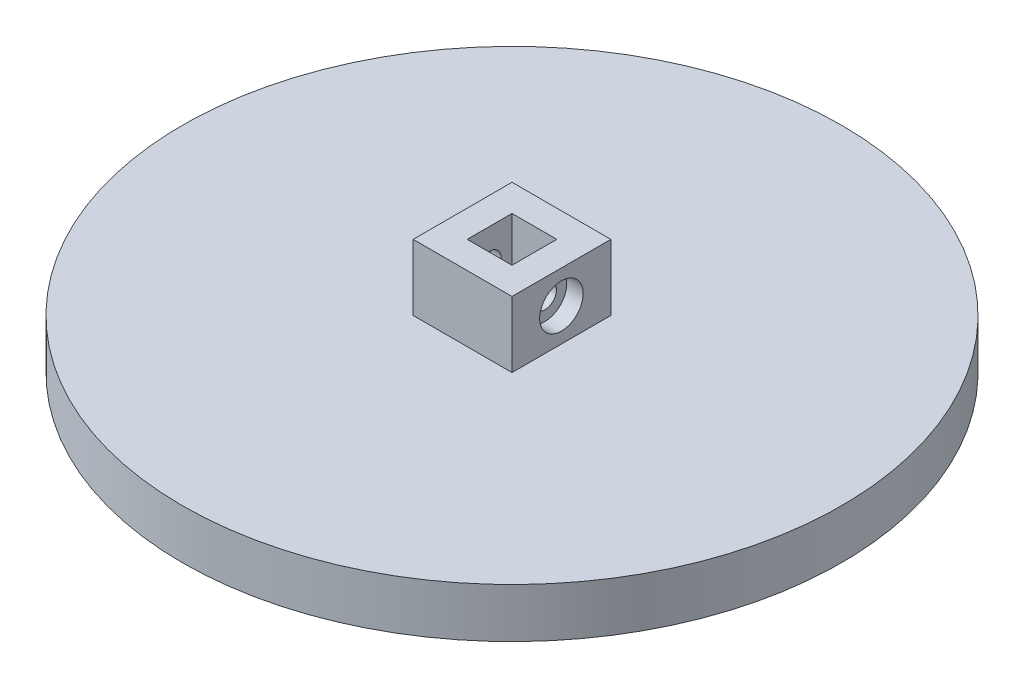
ISO-10303-21;
HEADER;
FILE_DESCRIPTION(('STEP AP214'),'2;1');
FILE_NAME('part.step','',(''),(''),'','','');
FILE_SCHEMA(('AUTOMOTIVE_DESIGN { 1 0 10303 214 1 1 1 1 }'));
ENDSEC;
DATA;
#1=APPLICATION_CONTEXT('core data for automotive mechanical design processes');
#2=APPLICATION_PROTOCOL_DEFINITION('international standard','automotive_design',2000,#1);
#3=PRODUCT_CONTEXT('',#1,'mechanical');
#4=PRODUCT('Part','Part','',(#3));
#5=PRODUCT_RELATED_PRODUCT_CATEGORY('part','',(#4));
#6=PRODUCT_DEFINITION_FORMATION('','',#4);
#7=PRODUCT_DEFINITION_CONTEXT('part definition',#1,'design');
#8=PRODUCT_DEFINITION('design','',#6,#7);
#9=PRODUCT_DEFINITION_SHAPE('','',#8);
#10=(LENGTH_UNIT() NAMED_UNIT(*) SI_UNIT(.MILLI.,.METRE.));
#11=(NAMED_UNIT(*) PLANE_ANGLE_UNIT() SI_UNIT($,.RADIAN.));
#12=(NAMED_UNIT(*) SI_UNIT($,.STERADIAN.) SOLID_ANGLE_UNIT());
#13=UNCERTAINTY_MEASURE_WITH_UNIT(LENGTH_MEASURE(1.E-05),#10,'distance_accuracy_value','');
#14=(GEOMETRIC_REPRESENTATION_CONTEXT(3) GLOBAL_UNCERTAINTY_ASSIGNED_CONTEXT((#13)) GLOBAL_UNIT_ASSIGNED_CONTEXT((#10,
#11,#12)) REPRESENTATION_CONTEXT('',''));
#15=CARTESIAN_POINT('',(0.,0.,0.));
#16=DIRECTION('',(0.,0.,1.));
#17=DIRECTION('',(1.,0.,0.));
#18=AXIS2_PLACEMENT_3D('',#15,#16,#17);
#19=CARTESIAN_POINT('',(-12.4497474683058,12.5,0.));
#20=DIRECTION('',(1.,0.,0.));
#21=DIRECTION('',(0.,0.,-1.));
#22=AXIS2_PLACEMENT_3D('',#19,#20,#21);
#23=CYLINDRICAL_SURFACE('',#22,1.75);
#24=CARTESIAN_POINT('',(3.4,12.5,0.));
#25=DIRECTION('',(1.,0.,0.));
#26=DIRECTION('',(0.,0.,-1.));
#27=AXIS2_PLACEMENT_3D('',#24,#25,#26);
#28=CIRCLE('',#27,1.75);
#29=CARTESIAN_POINT('',(3.4,12.5,-1.75));
#30=VERTEX_POINT('',#29);
#31=EDGE_CURVE('E175',#30,#30,#28,.F.);
#32=ORIENTED_EDGE('',*,*,#31,.T.);
#33=EDGE_LOOP('',(#32));
#34=FACE_BOUND('',#33,.T.);
#35=CARTESIAN_POINT('',(5.,12.5,0.));
#36=DIRECTION('',(1.,0.,0.));
#37=DIRECTION('',(0.,0.,-1.));
#38=AXIS2_PLACEMENT_3D('',#35,#36,#37);
#39=CIRCLE('',#38,1.75);
#40=CARTESIAN_POINT('',(5.,12.5,-1.75));
#41=VERTEX_POINT('',#40);
#42=EDGE_CURVE('E229',#41,#41,#39,.F.);
#43=ORIENTED_EDGE('',*,*,#42,.F.);
#44=EDGE_LOOP('',(#43));
#45=FACE_BOUND('',#44,.T.);
#46=ADVANCED_FACE('F37',(#34,#45),#23,.F.);
#47=CARTESIAN_POINT('',(-3.4,12.5,0.));
#48=DIRECTION('',(-1.,0.,0.));
#49=DIRECTION('',(0.,0.,1.));
#50=AXIS2_PLACEMENT_3D('',#47,#48,#49);
#51=CIRCLE('',#50,1.75);
#52=CARTESIAN_POINT('',(-3.4,12.5,1.75));
#53=VERTEX_POINT('',#52);
#54=EDGE_CURVE('E171',#53,#53,#51,.F.);
#55=ORIENTED_EDGE('',*,*,#54,.T.);
#56=EDGE_LOOP('',(#55));
#57=FACE_BOUND('',#56,.T.);
#58=CARTESIAN_POINT('',(-5.,12.5,0.));
#59=DIRECTION('',(-1.,0.,0.));
#60=DIRECTION('',(0.,0.,1.));
#61=AXIS2_PLACEMENT_3D('',#58,#59,#60);
#62=CIRCLE('',#61,1.75);
#63=CARTESIAN_POINT('',(-5.,12.5,1.75));
#64=VERTEX_POINT('',#63);
#65=EDGE_CURVE('E41',#64,#64,#62,.F.);
#66=ORIENTED_EDGE('',*,*,#65,.F.);
#67=EDGE_LOOP('',(#66));
#68=FACE_BOUND('',#67,.T.);
#69=ADVANCED_FACE('F273',(#57,#68),#23,.F.);
#70=CARTESIAN_POINT('',(0.,7.5,0.));
#71=DIRECTION('',(0.,-1.,0.));
#72=DIRECTION('',(0.,0.,-1.));
#73=AXIS2_PLACEMENT_3D('',#70,#71,#72);
#74=CYLINDRICAL_SURFACE('',#73,50.);
#75=CARTESIAN_POINT('',(0.,7.5,0.));
#76=DIRECTION('',(0.,1.,0.));
#77=DIRECTION('',(0.,0.,1.));
#78=AXIS2_PLACEMENT_3D('',#75,#76,#77);
#79=CIRCLE('',#78,50.);
#80=CARTESIAN_POINT('',(0.,7.5,50.));
#81=VERTEX_POINT('',#80);
#82=EDGE_CURVE('E11',#81,#81,#79,.T.);
#83=ORIENTED_EDGE('',*,*,#82,.F.);
#84=EDGE_LOOP('',(#83));
#85=FACE_BOUND('',#84,.T.);
#86=CARTESIAN_POINT('',(0.,0.,0.));
#87=DIRECTION('',(0.,1.,0.));
#88=DIRECTION('',(0.,0.,1.));
#89=AXIS2_PLACEMENT_3D('',#86,#87,#88);
#90=CIRCLE('',#89,50.);
#91=CARTESIAN_POINT('',(0.,0.,50.));
#92=VERTEX_POINT('',#91);
#93=EDGE_CURVE('E46',#92,#92,#90,.T.);
#94=ORIENTED_EDGE('',*,*,#93,.T.);
#95=EDGE_LOOP('',(#94));
#96=FACE_BOUND('',#95,.T.);
#97=ADVANCED_FACE('F39',(#85,#96),#74,.T.);
#98=CARTESIAN_POINT('',(0.,7.5,0.));
#99=DIRECTION('',(0.,1.,0.));
#100=DIRECTION('',(0.,0.,1.));
#101=AXIS2_PLACEMENT_3D('',#98,#99,#100);
#102=PLANE('',#101);
#103=DIRECTION('',(0.,0.,-1.));
#104=VECTOR('',#103,1.);
#105=CARTESIAN_POINT('',(7.5,7.5,7.5));
#106=LINE('',#105,#104);
#107=CARTESIAN_POINT('',(7.5,7.5,7.5));
#108=VERTEX_POINT('',#107);
#109=CARTESIAN_POINT('',(7.5,7.5,-7.5));
#110=VERTEX_POINT('',#109);
#111=EDGE_CURVE('E244',#108,#110,#106,.T.);
#112=ORIENTED_EDGE('',*,*,#111,.F.);
#113=DIRECTION('',(1.,0.,0.));
#114=VECTOR('',#113,1.);
#115=CARTESIAN_POINT('',(-7.5,7.5,7.5));
#116=LINE('',#115,#114);
#117=CARTESIAN_POINT('',(-7.5,7.5,7.5));
#118=VERTEX_POINT('',#117);
#119=EDGE_CURVE('E237',#118,#108,#116,.T.);
#120=ORIENTED_EDGE('',*,*,#119,.F.);
#121=DIRECTION('',(0.,0.,1.));
#122=VECTOR('',#121,1.);
#123=CARTESIAN_POINT('',(-7.5,7.5,7.5));
#124=LINE('',#123,#122);
#125=CARTESIAN_POINT('',(-7.5,7.5,-7.5));
#126=VERTEX_POINT('',#125);
#127=EDGE_CURVE('E250',#126,#118,#124,.T.);
#128=ORIENTED_EDGE('',*,*,#127,.F.);
#129=DIRECTION('',(-1.,0.,0.));
#130=VECTOR('',#129,1.);
#131=CARTESIAN_POINT('',(-7.5,7.5,-7.5));
#132=LINE('',#131,#130);
#133=EDGE_CURVE('E247',#110,#126,#132,.T.);
#134=ORIENTED_EDGE('',*,*,#133,.F.);
#135=EDGE_LOOP('',(#112,#120,#128,#134));
#136=FACE_BOUND('',#135,.T.);
#137=ORIENTED_EDGE('',*,*,#82,.T.);
#138=EDGE_LOOP('',(#137));
#139=FACE_BOUND('',#138,.T.);
#140=ADVANCED_FACE('F303',(#136,#139),#102,.T.);
#141=CARTESIAN_POINT('',(0.,0.,0.));
#142=DIRECTION('',(0.,1.,0.));
#143=DIRECTION('',(0.,0.,1.));
#144=AXIS2_PLACEMENT_3D('',#141,#142,#143);
#145=PLANE('',#144);
#146=DIRECTION('',(-1.,0.,0.));
#147=VECTOR('',#146,1.);
#148=CARTESIAN_POINT('',(-3.4,0.,3.4));
#149=LINE('',#148,#147);
#150=CARTESIAN_POINT('',(3.4,0.,3.4));
#151=VERTEX_POINT('',#150);
#152=CARTESIAN_POINT('',(-3.4,0.,3.4));
#153=VERTEX_POINT('',#152);
#154=EDGE_CURVE('E313',#151,#153,#149,.T.);
#155=ORIENTED_EDGE('',*,*,#154,.F.);
#156=DIRECTION('',(0.,0.,1.));
#157=VECTOR('',#156,1.);
#158=CARTESIAN_POINT('',(3.4,0.,3.4));
#159=LINE('',#158,#157);
#160=CARTESIAN_POINT('',(3.4,0.,-3.4));
#161=VERTEX_POINT('',#160);
#162=EDGE_CURVE('E172',#161,#151,#159,.T.);
#163=ORIENTED_EDGE('',*,*,#162,.F.);
#164=DIRECTION('',(1.,0.,0.));
#165=VECTOR('',#164,1.);
#166=CARTESIAN_POINT('',(-3.4,0.,-3.4));
#167=LINE('',#166,#165);
#168=CARTESIAN_POINT('',(-3.4,0.,-3.4));
#169=VERTEX_POINT('',#168);
#170=EDGE_CURVE('E169',#169,#161,#167,.T.);
#171=ORIENTED_EDGE('',*,*,#170,.F.);
#172=DIRECTION('',(0.,0.,-1.));
#173=VECTOR('',#172,1.);
#174=CARTESIAN_POINT('',(-3.4,0.,3.4));
#175=LINE('',#174,#173);
#176=EDGE_CURVE('E147',#153,#169,#175,.T.);
#177=ORIENTED_EDGE('',*,*,#176,.F.);
#178=EDGE_LOOP('',(#155,#163,#171,#177));
#179=FACE_BOUND('',#178,.T.);
#180=ORIENTED_EDGE('',*,*,#93,.F.);
#181=EDGE_LOOP('',(#180));
#182=FACE_BOUND('',#181,.T.);
#183=ADVANCED_FACE('F301',(#179,#182),#145,.F.);
#184=CARTESIAN_POINT('',(7.5,17.5,7.5));
#185=DIRECTION('',(-1.,0.,0.));
#186=DIRECTION('',(0.,0.,1.));
#187=AXIS2_PLACEMENT_3D('',#184,#185,#186);
#188=PLANE('',#187);
#189=CARTESIAN_POINT('',(7.5,12.5,0.));
#190=DIRECTION('',(1.,0.,0.));
#191=DIRECTION('',(0.,0.,-1.));
#192=AXIS2_PLACEMENT_3D('',#189,#190,#191);
#193=CIRCLE('',#192,3.3);
#194=CARTESIAN_POINT('',(7.5,12.5,-3.3));
#195=VERTEX_POINT('',#194);
#196=EDGE_CURVE('E230',#195,#195,#193,.T.);
#197=ORIENTED_EDGE('',*,*,#196,.F.);
#198=EDGE_LOOP('',(#197));
#199=FACE_BOUND('',#198,.T.);
#200=ORIENTED_EDGE('',*,*,#111,.T.);
#201=DIRECTION('',(0.,-1.,0.));
#202=VECTOR('',#201,1.);
#203=CARTESIAN_POINT('',(7.5,17.5,-7.5));
#204=LINE('',#203,#202);
#205=CARTESIAN_POINT('',(7.5,17.5,-7.5));
#206=VERTEX_POINT('',#205);
#207=EDGE_CURVE('E263',#206,#110,#204,.T.);
#208=ORIENTED_EDGE('',*,*,#207,.F.);
#209=DIRECTION('',(0.,0.,-1.));
#210=VECTOR('',#209,1.);
#211=CARTESIAN_POINT('',(7.5,17.5,7.5));
#212=LINE('',#211,#210);
#213=CARTESIAN_POINT('',(7.5,17.5,7.5));
#214=VERTEX_POINT('',#213);
#215=EDGE_CURVE('E233',#214,#206,#212,.T.);
#216=ORIENTED_EDGE('',*,*,#215,.F.);
#217=DIRECTION('',(0.,-1.,0.));
#218=VECTOR('',#217,1.);
#219=CARTESIAN_POINT('',(7.5,17.5,7.5));
#220=LINE('',#219,#218);
#221=EDGE_CURVE('E243',#214,#108,#220,.T.);
#222=ORIENTED_EDGE('',*,*,#221,.T.);
#223=EDGE_LOOP('',(#200,#208,#216,#222));
#224=FACE_BOUND('',#223,.T.);
#225=ADVANCED_FACE('F297',(#199,#224),#188,.F.);
#226=CARTESIAN_POINT('',(-7.5,17.5,-7.5));
#227=DIRECTION('',(0.,0.,1.));
#228=DIRECTION('',(1.,0.,0.));
#229=AXIS2_PLACEMENT_3D('',#226,#227,#228);
#230=PLANE('',#229);
#231=ORIENTED_EDGE('',*,*,#133,.T.);
#232=DIRECTION('',(0.,-1.,0.));
#233=VECTOR('',#232,1.);
#234=CARTESIAN_POINT('',(-7.5,17.5,-7.5));
#235=LINE('',#234,#233);
#236=CARTESIAN_POINT('',(-7.5,17.5,-7.5));
#237=VERTEX_POINT('',#236);
#238=EDGE_CURVE('E260',#237,#126,#235,.T.);
#239=ORIENTED_EDGE('',*,*,#238,.F.);
#240=DIRECTION('',(-1.,0.,0.));
#241=VECTOR('',#240,1.);
#242=CARTESIAN_POINT('',(-7.5,17.5,-7.5));
#243=LINE('',#242,#241);
#244=EDGE_CURVE('E236',#206,#237,#243,.T.);
#245=ORIENTED_EDGE('',*,*,#244,.F.);
#246=ORIENTED_EDGE('',*,*,#207,.T.);
#247=EDGE_LOOP('',(#231,#239,#245,#246));
#248=FACE_BOUND('',#247,.T.);
#249=ADVANCED_FACE('F293',(#248),#230,.F.);
#250=CARTESIAN_POINT('',(-7.5,17.5,7.5));
#251=DIRECTION('',(1.,0.,0.));
#252=DIRECTION('',(0.,0.,-1.));
#253=AXIS2_PLACEMENT_3D('',#250,#251,#252);
#254=PLANE('',#253);
#255=DIRECTION('',(0.,-0.866025403784439,0.5));
#256=VECTOR('',#255,1.);
#257=CARTESIAN_POINT('',(-7.5,12.5,-3.35));
#258=LINE('',#257,#256);
#259=CARTESIAN_POINT('',(-7.5,12.5,-3.35));
#260=VERTEX_POINT('',#259);
#261=CARTESIAN_POINT('',(-7.5,9.59881489732213,-1.675));
#262=VERTEX_POINT('',#261);
#263=EDGE_CURVE('E200',#260,#262,#258,.T.);
#264=ORIENTED_EDGE('',*,*,#263,.F.);
#265=DIRECTION('',(0.,-0.866025403784439,-0.5));
#266=VECTOR('',#265,1.);
#267=CARTESIAN_POINT('',(-7.5,15.4011851026779,-1.675));
#268=LINE('',#267,#266);
#269=CARTESIAN_POINT('',(-7.5,15.4011851026779,-1.675));
#270=VERTEX_POINT('',#269);
#271=EDGE_CURVE('E178',#270,#260,#268,.T.);
#272=ORIENTED_EDGE('',*,*,#271,.F.);
#273=DIRECTION('',(0.,0.,-1.));
#274=VECTOR('',#273,1.);
#275=CARTESIAN_POINT('',(-7.5,15.4011851026779,1.675));
#276=LINE('',#275,#274);
#277=CARTESIAN_POINT('',(-7.5,15.4011851026779,1.675));
#278=VERTEX_POINT('',#277);
#279=EDGE_CURVE('E183',#278,#270,#276,.T.);
#280=ORIENTED_EDGE('',*,*,#279,.F.);
#281=DIRECTION('',(0.,0.866025403784439,-0.5));
#282=VECTOR('',#281,1.);
#283=CARTESIAN_POINT('',(-7.5,12.5,3.35));
#284=LINE('',#283,#282);
#285=CARTESIAN_POINT('',(-7.5,12.5,3.35));
#286=VERTEX_POINT('',#285);
#287=EDGE_CURVE('E209',#286,#278,#284,.T.);
#288=ORIENTED_EDGE('',*,*,#287,.F.);
#289=DIRECTION('',(0.,0.866025403784439,0.5));
#290=VECTOR('',#289,1.);
#291=CARTESIAN_POINT('',(-7.5,9.59881489732213,1.675));
#292=LINE('',#291,#290);
#293=CARTESIAN_POINT('',(-7.5,9.59881489732213,1.675));
#294=VERTEX_POINT('',#293);
#295=EDGE_CURVE('E206',#294,#286,#292,.T.);
#296=ORIENTED_EDGE('',*,*,#295,.F.);
#297=DIRECTION('',(0.,0.,1.));
#298=VECTOR('',#297,1.);
#299=CARTESIAN_POINT('',(-7.5,9.59881489732213,-1.675));
#300=LINE('',#299,#298);
#301=EDGE_CURVE('E203',#262,#294,#300,.T.);
#302=ORIENTED_EDGE('',*,*,#301,.F.);
#303=EDGE_LOOP('',(#264,#272,#280,#288,#296,#302));
#304=FACE_BOUND('',#303,.T.);
#305=ORIENTED_EDGE('',*,*,#127,.T.);
#306=DIRECTION('',(0.,-1.,0.));
#307=VECTOR('',#306,1.);
#308=CARTESIAN_POINT('',(-7.5,17.5,7.5));
#309=LINE('',#308,#307);
#310=CARTESIAN_POINT('',(-7.5,17.5,7.5));
#311=VERTEX_POINT('',#310);
#312=EDGE_CURVE('E257',#311,#118,#309,.T.);
#313=ORIENTED_EDGE('',*,*,#312,.F.);
#314=DIRECTION('',(0.,0.,1.));
#315=VECTOR('',#314,1.);
#316=CARTESIAN_POINT('',(-7.5,17.5,7.5));
#317=LINE('',#316,#315);
#318=EDGE_CURVE('E239',#237,#311,#317,.T.);
#319=ORIENTED_EDGE('',*,*,#318,.F.);
#320=ORIENTED_EDGE('',*,*,#238,.T.);
#321=EDGE_LOOP('',(#305,#313,#319,#320));
#322=FACE_BOUND('',#321,.T.);
#323=ADVANCED_FACE('F289',(#304,#322),#254,.F.);
#324=CARTESIAN_POINT('',(-7.5,17.5,7.5));
#325=DIRECTION('',(0.,0.,-1.));
#326=DIRECTION('',(-1.,0.,0.));
#327=AXIS2_PLACEMENT_3D('',#324,#325,#326);
#328=PLANE('',#327);
#329=ORIENTED_EDGE('',*,*,#119,.T.);
#330=ORIENTED_EDGE('',*,*,#221,.F.);
#331=DIRECTION('',(1.,0.,0.));
#332=VECTOR('',#331,1.);
#333=CARTESIAN_POINT('',(-7.5,17.5,7.5));
#334=LINE('',#333,#332);
#335=EDGE_CURVE('E241',#311,#214,#334,.T.);
#336=ORIENTED_EDGE('',*,*,#335,.F.);
#337=ORIENTED_EDGE('',*,*,#312,.T.);
#338=EDGE_LOOP('',(#329,#330,#336,#337));
#339=FACE_BOUND('',#338,.T.);
#340=ADVANCED_FACE('F286',(#339),#328,.F.);
#341=CARTESIAN_POINT('',(0.,17.5,0.));
#342=DIRECTION('',(0.,-1.,0.));
#343=DIRECTION('',(0.,0.,-1.));
#344=AXIS2_PLACEMENT_3D('',#341,#342,#343);
#345=PLANE('',#344);
#346=DIRECTION('',(-1.,0.,0.));
#347=VECTOR('',#346,1.);
#348=CARTESIAN_POINT('',(-3.4,17.5,-3.4));
#349=LINE('',#348,#347);
#350=CARTESIAN_POINT('',(3.4,17.5,-3.4));
#351=VERTEX_POINT('',#350);
#352=CARTESIAN_POINT('',(-3.4,17.5,-3.4));
#353=VERTEX_POINT('',#352);
#354=EDGE_CURVE('E153',#351,#353,#349,.T.);
#355=ORIENTED_EDGE('',*,*,#354,.F.);
#356=DIRECTION('',(0.,0.,-1.));
#357=VECTOR('',#356,1.);
#358=CARTESIAN_POINT('',(3.4,17.5,3.4));
#359=LINE('',#358,#357);
#360=CARTESIAN_POINT('',(3.4,17.5,3.4));
#361=VERTEX_POINT('',#360);
#362=EDGE_CURVE('E62',#361,#351,#359,.T.);
#363=ORIENTED_EDGE('',*,*,#362,.F.);
#364=DIRECTION('',(1.,0.,0.));
#365=VECTOR('',#364,1.);
#366=CARTESIAN_POINT('',(-3.4,17.5,3.4));
#367=LINE('',#366,#365);
#368=CARTESIAN_POINT('',(-3.4,17.5,3.4));
#369=VERTEX_POINT('',#368);
#370=EDGE_CURVE('E160',#369,#361,#367,.T.);
#371=ORIENTED_EDGE('',*,*,#370,.F.);
#372=DIRECTION('',(0.,0.,1.));
#373=VECTOR('',#372,1.);
#374=CARTESIAN_POINT('',(-3.4,17.5,3.4));
#375=LINE('',#374,#373);
#376=EDGE_CURVE('E144',#353,#369,#375,.T.);
#377=ORIENTED_EDGE('',*,*,#376,.F.);
#378=EDGE_LOOP('',(#355,#363,#371,#377));
#379=FACE_BOUND('',#378,.T.);
#380=ORIENTED_EDGE('',*,*,#215,.T.);
#381=ORIENTED_EDGE('',*,*,#244,.T.);
#382=ORIENTED_EDGE('',*,*,#318,.T.);
#383=ORIENTED_EDGE('',*,*,#335,.T.);
#384=EDGE_LOOP('',(#380,#381,#382,#383));
#385=FACE_BOUND('',#384,.T.);
#386=ADVANCED_FACE('F157',(#379,#385),#345,.F.);
#387=CARTESIAN_POINT('',(5.,12.5,0.));
#388=DIRECTION('',(1.,0.,0.));
#389=DIRECTION('',(0.,0.,-1.));
#390=AXIS2_PLACEMENT_3D('',#387,#388,#389);
#391=PLANE('',#390);
#392=CARTESIAN_POINT('',(5.,12.5,0.));
#393=DIRECTION('',(1.,0.,0.));
#394=DIRECTION('',(0.,0.,-1.));
#395=AXIS2_PLACEMENT_3D('',#392,#393,#394);
#396=CIRCLE('',#395,3.3);
#397=CARTESIAN_POINT('',(5.,12.5,-3.3));
#398=VERTEX_POINT('',#397);
#399=EDGE_CURVE('E226',#398,#398,#396,.T.);
#400=ORIENTED_EDGE('',*,*,#399,.T.);
#401=EDGE_LOOP('',(#400));
#402=FACE_BOUND('',#401,.T.);
#403=ORIENTED_EDGE('',*,*,#42,.T.);
#404=EDGE_LOOP('',(#403));
#405=FACE_BOUND('',#404,.T.);
#406=ADVANCED_FACE('F270',(#402,#405),#391,.T.);
#407=CARTESIAN_POINT('',(5.,12.5,0.));
#408=DIRECTION('',(1.,0.,0.));
#409=DIRECTION('',(0.,0.,-1.));
#410=AXIS2_PLACEMENT_3D('',#407,#408,#409);
#411=CYLINDRICAL_SURFACE('',#410,3.3);
#412=ORIENTED_EDGE('',*,*,#399,.F.);
#413=EDGE_LOOP('',(#412));
#414=FACE_BOUND('',#413,.T.);
#415=ORIENTED_EDGE('',*,*,#196,.T.);
#416=EDGE_LOOP('',(#415));
#417=FACE_BOUND('',#416,.T.);
#418=ADVANCED_FACE('F282',(#414,#417),#411,.F.);
#419=CARTESIAN_POINT('',(-5.,0.,0.));
#420=DIRECTION('',(-1.,0.,0.));
#421=DIRECTION('',(0.,0.,1.));
#422=AXIS2_PLACEMENT_3D('',#419,#420,#421);
#423=PLANE('',#422);
#424=DIRECTION('',(0.,-0.866025403784439,-0.5));
#425=VECTOR('',#424,1.);
#426=CARTESIAN_POINT('',(-5.,15.4011851026779,-1.675));
#427=LINE('',#426,#425);
#428=CARTESIAN_POINT('',(-5.,15.4011851026779,-1.675));
#429=VERTEX_POINT('',#428);
#430=CARTESIAN_POINT('',(-5.,12.5,-3.35));
#431=VERTEX_POINT('',#430);
#432=EDGE_CURVE('E179',#429,#431,#427,.T.);
#433=ORIENTED_EDGE('',*,*,#432,.T.);
#434=DIRECTION('',(0.,-0.866025403784439,0.5));
#435=VECTOR('',#434,1.);
#436=CARTESIAN_POINT('',(-5.,12.5,-3.35));
#437=LINE('',#436,#435);
#438=CARTESIAN_POINT('',(-5.,9.59881489732213,-1.675));
#439=VERTEX_POINT('',#438);
#440=EDGE_CURVE('E182',#431,#439,#437,.T.);
#441=ORIENTED_EDGE('',*,*,#440,.T.);
#442=DIRECTION('',(0.,0.,1.));
#443=VECTOR('',#442,1.);
#444=CARTESIAN_POINT('',(-5.,9.59881489732213,-1.675));
#445=LINE('',#444,#443);
#446=CARTESIAN_POINT('',(-5.,9.59881489732213,1.675));
#447=VERTEX_POINT('',#446);
#448=EDGE_CURVE('E186',#439,#447,#445,.T.);
#449=ORIENTED_EDGE('',*,*,#448,.T.);
#450=DIRECTION('',(0.,0.866025403784439,0.5));
#451=VECTOR('',#450,1.);
#452=CARTESIAN_POINT('',(-5.,9.59881489732213,1.675));
#453=LINE('',#452,#451);
#454=CARTESIAN_POINT('',(-5.,12.5,3.35));
#455=VERTEX_POINT('',#454);
#456=EDGE_CURVE('E189',#447,#455,#453,.T.);
#457=ORIENTED_EDGE('',*,*,#456,.T.);
#458=DIRECTION('',(0.,0.866025403784439,-0.5));
#459=VECTOR('',#458,1.);
#460=CARTESIAN_POINT('',(-5.,12.5,3.35));
#461=LINE('',#460,#459);
#462=CARTESIAN_POINT('',(-5.,15.4011851026779,1.675));
#463=VERTEX_POINT('',#462);
#464=EDGE_CURVE('E192',#455,#463,#461,.T.);
#465=ORIENTED_EDGE('',*,*,#464,.T.);
#466=DIRECTION('',(0.,0.,-1.));
#467=VECTOR('',#466,1.);
#468=CARTESIAN_POINT('',(-5.,15.4011851026779,1.675));
#469=LINE('',#468,#467);
#470=EDGE_CURVE('E195',#463,#429,#469,.T.);
#471=ORIENTED_EDGE('',*,*,#470,.T.);
#472=EDGE_LOOP('',(#433,#441,#449,#457,#465,#471));
#473=FACE_BOUND('',#472,.T.);
#474=ORIENTED_EDGE('',*,*,#65,.T.);
#475=EDGE_LOOP('',(#474));
#476=FACE_BOUND('',#475,.T.);
#477=ADVANCED_FACE('F366',(#473,#476),#423,.T.);
#478=CARTESIAN_POINT('',(-5.,15.4011851026779,-1.675));
#479=DIRECTION('',(0.,0.5,-0.866025403784439));
#480=DIRECTION('',(0.,0.866025403784439,0.5));
#481=AXIS2_PLACEMENT_3D('',#478,#479,#480);
#482=PLANE('',#481);
#483=ORIENTED_EDGE('',*,*,#271,.T.);
#484=DIRECTION('',(-1.,0.,0.));
#485=VECTOR('',#484,1.);
#486=CARTESIAN_POINT('',(-5.,12.5,-3.35));
#487=LINE('',#486,#485);
#488=EDGE_CURVE('E198',#431,#260,#487,.T.);
#489=ORIENTED_EDGE('',*,*,#488,.F.);
#490=ORIENTED_EDGE('',*,*,#432,.F.);
#491=DIRECTION('',(-1.,0.,0.));
#492=VECTOR('',#491,1.);
#493=CARTESIAN_POINT('',(-5.,15.4011851026779,-1.675));
#494=LINE('',#493,#492);
#495=EDGE_CURVE('E214',#429,#270,#494,.T.);
#496=ORIENTED_EDGE('',*,*,#495,.T.);
#497=EDGE_LOOP('',(#483,#489,#490,#496));
#498=FACE_BOUND('',#497,.T.);
#499=ADVANCED_FACE('F381',(#498),#482,.F.);
#500=CARTESIAN_POINT('',(-5.,15.4011851026779,1.675));
#501=DIRECTION('',(0.,1.,0.));
#502=DIRECTION('',(0.,0.,1.));
#503=AXIS2_PLACEMENT_3D('',#500,#501,#502);
#504=PLANE('',#503);
#505=ORIENTED_EDGE('',*,*,#279,.T.);
#506=ORIENTED_EDGE('',*,*,#495,.F.);
#507=ORIENTED_EDGE('',*,*,#470,.F.);
#508=DIRECTION('',(-1.,0.,0.));
#509=VECTOR('',#508,1.);
#510=CARTESIAN_POINT('',(-5.,15.4011851026779,1.675));
#511=LINE('',#510,#509);
#512=EDGE_CURVE('E216',#463,#278,#511,.T.);
#513=ORIENTED_EDGE('',*,*,#512,.T.);
#514=EDGE_LOOP('',(#505,#506,#507,#513));
#515=FACE_BOUND('',#514,.T.);
#516=ADVANCED_FACE('F391',(#515),#504,.F.);
#517=CARTESIAN_POINT('',(-5.,12.5,3.35));
#518=DIRECTION('',(0.,0.5,0.866025403784439));
#519=DIRECTION('',(0.,-0.866025403784439,0.5));
#520=AXIS2_PLACEMENT_3D('',#517,#518,#519);
#521=PLANE('',#520);
#522=ORIENTED_EDGE('',*,*,#287,.T.);
#523=ORIENTED_EDGE('',*,*,#512,.F.);
#524=ORIENTED_EDGE('',*,*,#464,.F.);
#525=DIRECTION('',(-1.,0.,0.));
#526=VECTOR('',#525,1.);
#527=CARTESIAN_POINT('',(-5.,12.5,3.35));
#528=LINE('',#527,#526);
#529=EDGE_CURVE('E218',#455,#286,#528,.T.);
#530=ORIENTED_EDGE('',*,*,#529,.T.);
#531=EDGE_LOOP('',(#522,#523,#524,#530));
#532=FACE_BOUND('',#531,.T.);
#533=ADVANCED_FACE('F401',(#532),#521,.F.);
#534=CARTESIAN_POINT('',(-5.,9.59881489732213,1.675));
#535=DIRECTION('',(0.,-0.5,0.866025403784439));
#536=DIRECTION('',(0.,-0.866025403784439,-0.5));
#537=AXIS2_PLACEMENT_3D('',#534,#535,#536);
#538=PLANE('',#537);
#539=ORIENTED_EDGE('',*,*,#295,.T.);
#540=ORIENTED_EDGE('',*,*,#529,.F.);
#541=ORIENTED_EDGE('',*,*,#456,.F.);
#542=DIRECTION('',(-1.,0.,0.));
#543=VECTOR('',#542,1.);
#544=CARTESIAN_POINT('',(-5.,9.59881489732213,1.675));
#545=LINE('',#544,#543);
#546=EDGE_CURVE('E220',#447,#294,#545,.T.);
#547=ORIENTED_EDGE('',*,*,#546,.T.);
#548=EDGE_LOOP('',(#539,#540,#541,#547));
#549=FACE_BOUND('',#548,.T.);
#550=ADVANCED_FACE('F411',(#549),#538,.F.);
#551=CARTESIAN_POINT('',(-5.,9.59881489732213,-1.675));
#552=DIRECTION('',(0.,-1.,0.));
#553=DIRECTION('',(0.,0.,-1.));
#554=AXIS2_PLACEMENT_3D('',#551,#552,#553);
#555=PLANE('',#554);
#556=ORIENTED_EDGE('',*,*,#301,.T.);
#557=ORIENTED_EDGE('',*,*,#546,.F.);
#558=ORIENTED_EDGE('',*,*,#448,.F.);
#559=DIRECTION('',(-1.,0.,0.));
#560=VECTOR('',#559,1.);
#561=CARTESIAN_POINT('',(-5.,9.59881489732213,-1.675));
#562=LINE('',#561,#560);
#563=EDGE_CURVE('E222',#439,#262,#562,.T.);
#564=ORIENTED_EDGE('',*,*,#563,.T.);
#565=EDGE_LOOP('',(#556,#557,#558,#564));
#566=FACE_BOUND('',#565,.T.);
#567=ADVANCED_FACE('F421',(#566),#555,.F.);
#568=CARTESIAN_POINT('',(-5.,12.5,-3.35));
#569=DIRECTION('',(0.,-0.5,-0.866025403784439));
#570=DIRECTION('',(0.,0.866025403784439,-0.5));
#571=AXIS2_PLACEMENT_3D('',#568,#569,#570);
#572=PLANE('',#571);
#573=ORIENTED_EDGE('',*,*,#263,.T.);
#574=ORIENTED_EDGE('',*,*,#563,.F.);
#575=ORIENTED_EDGE('',*,*,#440,.F.);
#576=ORIENTED_EDGE('',*,*,#488,.T.);
#577=EDGE_LOOP('',(#573,#574,#575,#576));
#578=FACE_BOUND('',#577,.T.);
#579=ADVANCED_FACE('F431',(#578),#572,.F.);
#580=CARTESIAN_POINT('',(3.4,-9.61665222413705,3.4));
#581=DIRECTION('',(1.,0.,0.));
#582=DIRECTION('',(0.,0.,-1.));
#583=AXIS2_PLACEMENT_3D('',#580,#581,#582);
#584=PLANE('',#583);
#585=ORIENTED_EDGE('',*,*,#162,.T.);
#586=DIRECTION('',(0.,1.,0.));
#587=VECTOR('',#586,1.);
#588=CARTESIAN_POINT('',(3.4,-9.61665222413705,3.4));
#589=LINE('',#588,#587);
#590=EDGE_CURVE('E165',#151,#361,#589,.T.);
#591=ORIENTED_EDGE('',*,*,#590,.T.);
#592=ORIENTED_EDGE('',*,*,#362,.T.);
#593=DIRECTION('',(0.,1.,0.));
#594=VECTOR('',#593,1.);
#595=CARTESIAN_POINT('',(3.4,-9.61665222413705,-3.4));
#596=LINE('',#595,#594);
#597=EDGE_CURVE('E150',#161,#351,#596,.T.);
#598=ORIENTED_EDGE('',*,*,#597,.F.);
#599=EDGE_LOOP('',(#585,#591,#592,#598));
#600=FACE_BOUND('',#599,.T.);
#601=ORIENTED_EDGE('',*,*,#31,.F.);
#602=EDGE_LOOP('',(#601));
#603=FACE_BOUND('',#602,.T.);
#604=ADVANCED_FACE('F440',(#600,#603),#584,.F.);
#605=CARTESIAN_POINT('',(-3.4,-9.61665222413705,3.4));
#606=DIRECTION('',(-1.,0.,0.));
#607=DIRECTION('',(0.,0.,1.));
#608=AXIS2_PLACEMENT_3D('',#605,#606,#607);
#609=PLANE('',#608);
#610=ORIENTED_EDGE('',*,*,#176,.T.);
#611=DIRECTION('',(0.,1.,0.));
#612=VECTOR('',#611,1.);
#613=CARTESIAN_POINT('',(-3.4,-9.61665222413705,-3.4));
#614=LINE('',#613,#612);
#615=EDGE_CURVE('E54',#169,#353,#614,.T.);
#616=ORIENTED_EDGE('',*,*,#615,.T.);
#617=ORIENTED_EDGE('',*,*,#376,.T.);
#618=DIRECTION('',(0.,1.,0.));
#619=VECTOR('',#618,1.);
#620=CARTESIAN_POINT('',(-3.4,-9.61665222413705,3.4));
#621=LINE('',#620,#619);
#622=EDGE_CURVE('E149',#153,#369,#621,.T.);
#623=ORIENTED_EDGE('',*,*,#622,.F.);
#624=EDGE_LOOP('',(#610,#616,#617,#623));
#625=FACE_BOUND('',#624,.T.);
#626=ORIENTED_EDGE('',*,*,#54,.F.);
#627=EDGE_LOOP('',(#626));
#628=FACE_BOUND('',#627,.T.);
#629=ADVANCED_FACE('F140',(#625,#628),#609,.F.);
#630=CARTESIAN_POINT('',(-3.4,-9.61665222413705,3.4));
#631=DIRECTION('',(0.,0.,1.));
#632=DIRECTION('',(1.,0.,0.));
#633=AXIS2_PLACEMENT_3D('',#630,#631,#632);
#634=PLANE('',#633);
#635=ORIENTED_EDGE('',*,*,#154,.T.);
#636=ORIENTED_EDGE('',*,*,#622,.T.);
#637=ORIENTED_EDGE('',*,*,#370,.T.);
#638=ORIENTED_EDGE('',*,*,#590,.F.);
#639=EDGE_LOOP('',(#635,#636,#637,#638));
#640=FACE_BOUND('',#639,.T.);
#641=ADVANCED_FACE('F474',(#640),#634,.F.);
#642=CARTESIAN_POINT('',(-3.4,-9.61665222413705,-3.4));
#643=DIRECTION('',(0.,0.,-1.));
#644=DIRECTION('',(-1.,0.,0.));
#645=AXIS2_PLACEMENT_3D('',#642,#643,#644);
#646=PLANE('',#645);
#647=ORIENTED_EDGE('',*,*,#170,.T.);
#648=ORIENTED_EDGE('',*,*,#597,.T.);
#649=ORIENTED_EDGE('',*,*,#354,.T.);
#650=ORIENTED_EDGE('',*,*,#615,.F.);
#651=EDGE_LOOP('',(#647,#648,#649,#650));
#652=FACE_BOUND('',#651,.T.);
#653=ADVANCED_FACE('F154',(#652),#646,.F.);
#654=CLOSED_SHELL('',(#46,#69,#97,#140,#183,#225,#249,#323,#340,#386,#406,#418,#477,#499,#516,
#533,#550,#567,#579,#604,#629,#641,#653));
#655=MANIFOLD_SOLID_BREP('B2',#654);
#656=ADVANCED_BREP_SHAPE_REPRESENTATION('',(#18,#655),#14);
#657=SHAPE_DEFINITION_REPRESENTATION(#9,#656);
ENDSEC;
END-ISO-10303-21;
